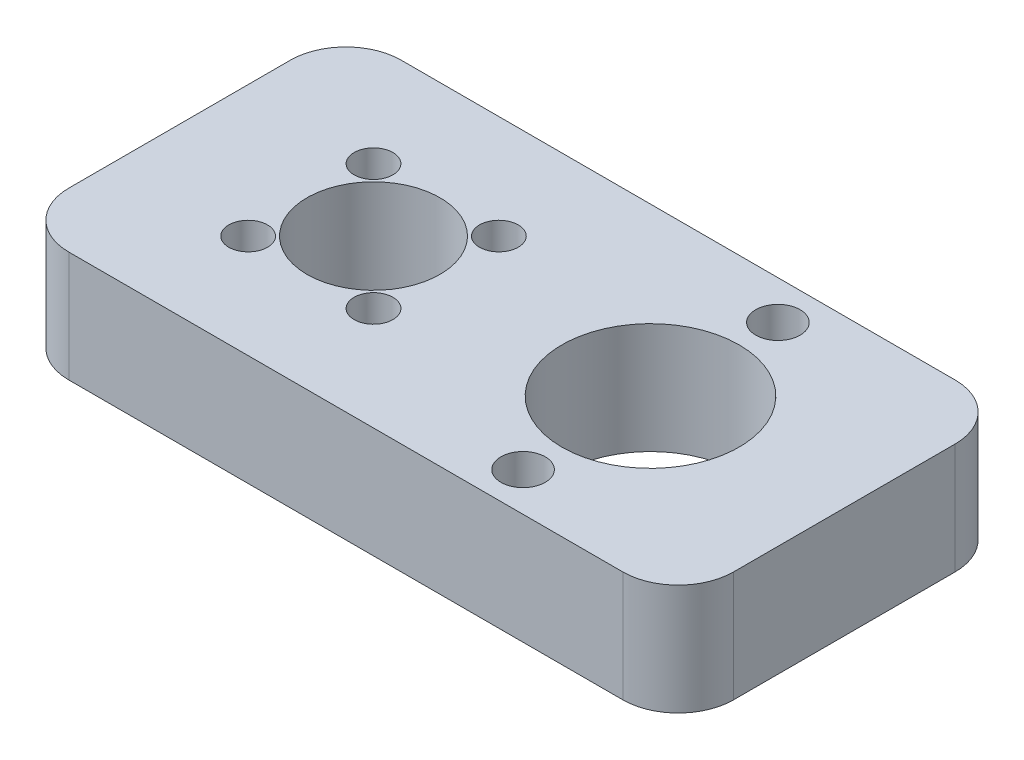
ISO-10303-21;
HEADER;
FILE_DESCRIPTION(('STEP AP214'),'2;1');
FILE_NAME('part.step','',(''),(''),'','','');
FILE_SCHEMA(('AUTOMOTIVE_DESIGN { 1 0 10303 214 1 1 1 1 }'));
ENDSEC;
DATA;
#1=APPLICATION_CONTEXT('core data for automotive mechanical design processes');
#2=APPLICATION_PROTOCOL_DEFINITION('international standard','automotive_design',2000,#1);
#3=PRODUCT_CONTEXT('',#1,'mechanical');
#4=PRODUCT('Part','Part','',(#3));
#5=PRODUCT_RELATED_PRODUCT_CATEGORY('part','',(#4));
#6=PRODUCT_DEFINITION_FORMATION('','',#4);
#7=PRODUCT_DEFINITION_CONTEXT('part definition',#1,'design');
#8=PRODUCT_DEFINITION('design','',#6,#7);
#9=PRODUCT_DEFINITION_SHAPE('','',#8);
#10=(LENGTH_UNIT() NAMED_UNIT(*) SI_UNIT(.MILLI.,.METRE.));
#11=(NAMED_UNIT(*) PLANE_ANGLE_UNIT() SI_UNIT($,.RADIAN.));
#12=(NAMED_UNIT(*) SI_UNIT($,.STERADIAN.) SOLID_ANGLE_UNIT());
#13=UNCERTAINTY_MEASURE_WITH_UNIT(LENGTH_MEASURE(1.E-05),#10,'distance_accuracy_value','');
#14=(GEOMETRIC_REPRESENTATION_CONTEXT(3) GLOBAL_UNCERTAINTY_ASSIGNED_CONTEXT((#13)) GLOBAL_UNIT_ASSIGNED_CONTEXT((#10,
#11,#12)) REPRESENTATION_CONTEXT('',''));
#15=CARTESIAN_POINT('',(0.,0.,0.));
#16=DIRECTION('',(0.,0.,1.));
#17=DIRECTION('',(1.,0.,0.));
#18=AXIS2_PLACEMENT_3D('',#15,#16,#17);
#19=CARTESIAN_POINT('',(0.,10.,0.));
#20=DIRECTION('',(0.,1.,0.));
#21=DIRECTION('',(0.,0.,1.));
#22=AXIS2_PLACEMENT_3D('',#19,#20,#21);
#23=PLANE('',#22);
#24=CARTESIAN_POINT('',(-18.1568542494924,10.,5.65685424949241));
#25=DIRECTION('',(0.,1.,0.));
#26=DIRECTION('',(0.,0.,1.));
#27=AXIS2_PLACEMENT_3D('',#24,#25,#26);
#28=CIRCLE('',#27,1.75);
#29=CARTESIAN_POINT('',(-18.1568542494924,10.,7.40685424949241));
#30=VERTEX_POINT('',#29);
#31=EDGE_CURVE('E253',#30,#30,#28,.T.);
#32=ORIENTED_EDGE('',*,*,#31,.F.);
#33=EDGE_LOOP('',(#32));
#34=FACE_BOUND('',#33,.T.);
#35=CARTESIAN_POINT('',(12.5,10.,0.));
#36=DIRECTION('',(0.,1.,0.));
#37=DIRECTION('',(0.,0.,1.));
#38=AXIS2_PLACEMENT_3D('',#35,#36,#37);
#39=CIRCLE('',#38,8.);
#40=CARTESIAN_POINT('',(12.5,10.,8.));
#41=VERTEX_POINT('',#40);
#42=EDGE_CURVE('E237',#41,#41,#39,.T.);
#43=ORIENTED_EDGE('',*,*,#42,.F.);
#44=EDGE_LOOP('',(#43));
#45=FACE_BOUND('',#44,.T.);
#46=CARTESIAN_POINT('',(-18.1568542494924,10.,-5.65685424949235));
#47=DIRECTION('',(0.,1.,0.));
#48=DIRECTION('',(0.,0.,1.));
#49=AXIS2_PLACEMENT_3D('',#46,#47,#48);
#50=CIRCLE('',#49,1.75);
#51=CARTESIAN_POINT('',(-18.1568542494924,10.,-3.90685424949235));
#52=VERTEX_POINT('',#51);
#53=EDGE_CURVE('E221',#52,#52,#50,.T.);
#54=ORIENTED_EDGE('',*,*,#53,.F.);
#55=EDGE_LOOP('',(#54));
#56=FACE_BOUND('',#55,.T.);
#57=CARTESIAN_POINT('',(12.5,10.,11.5));
#58=DIRECTION('',(0.,1.,0.));
#59=DIRECTION('',(0.,0.,1.));
#60=AXIS2_PLACEMENT_3D('',#57,#58,#59);
#61=CIRCLE('',#60,2.);
#62=CARTESIAN_POINT('',(12.5,10.,13.5));
#63=VERTEX_POINT('',#62);
#64=EDGE_CURVE('E139',#63,#63,#61,.T.);
#65=ORIENTED_EDGE('',*,*,#64,.F.);
#66=EDGE_LOOP('',(#65));
#67=FACE_BOUND('',#66,.T.);
#68=DIRECTION('',(1.,0.,0.));
#69=VECTOR('',#68,1.);
#70=CARTESIAN_POINT('',(-30.,10.,15.));
#71=LINE('',#70,#69);
#72=CARTESIAN_POINT('',(-25.,10.,15.));
#73=VERTEX_POINT('',#72);
#74=CARTESIAN_POINT('',(25.,10.,15.));
#75=VERTEX_POINT('',#74);
#76=EDGE_CURVE('E150',#73,#75,#71,.T.);
#77=ORIENTED_EDGE('',*,*,#76,.T.);
#78=CARTESIAN_POINT('',(25.,10.,10.));
#79=DIRECTION('',(0.,1.,0.));
#80=DIRECTION('',(0.,0.,1.));
#81=AXIS2_PLACEMENT_3D('',#78,#79,#80);
#82=CIRCLE('',#81,5.);
#83=CARTESIAN_POINT('',(30.,10.,9.99999999999999));
#84=VERTEX_POINT('',#83);
#85=EDGE_CURVE('E180',#75,#84,#82,.T.);
#86=ORIENTED_EDGE('',*,*,#85,.T.);
#87=DIRECTION('',(0.,0.,-1.));
#88=VECTOR('',#87,1.);
#89=CARTESIAN_POINT('',(30.,10.,-15.));
#90=LINE('',#89,#88);
#91=CARTESIAN_POINT('',(30.,10.,-10.));
#92=VERTEX_POINT('',#91);
#93=EDGE_CURVE('E129',#84,#92,#90,.T.);
#94=ORIENTED_EDGE('',*,*,#93,.T.);
#95=CARTESIAN_POINT('',(25.,10.,-9.99999999999999));
#96=DIRECTION('',(0.,1.,0.));
#97=DIRECTION('',(0.,0.,1.));
#98=AXIS2_PLACEMENT_3D('',#95,#96,#97);
#99=CIRCLE('',#98,5.);
#100=CARTESIAN_POINT('',(25.,10.,-15.));
#101=VERTEX_POINT('',#100);
#102=EDGE_CURVE('E172',#92,#101,#99,.T.);
#103=ORIENTED_EDGE('',*,*,#102,.T.);
#104=DIRECTION('',(-1.,0.,0.));
#105=VECTOR('',#104,1.);
#106=CARTESIAN_POINT('',(-30.,10.,-15.));
#107=LINE('',#106,#105);
#108=CARTESIAN_POINT('',(-25.,10.,-15.));
#109=VERTEX_POINT('',#108);
#110=EDGE_CURVE('E195',#101,#109,#107,.T.);
#111=ORIENTED_EDGE('',*,*,#110,.T.);
#112=CARTESIAN_POINT('',(-25.,10.,-10.));
#113=DIRECTION('',(0.,1.,0.));
#114=DIRECTION('',(0.,0.,1.));
#115=AXIS2_PLACEMENT_3D('',#112,#113,#114);
#116=CIRCLE('',#115,5.);
#117=CARTESIAN_POINT('',(-30.,10.,-10.));
#118=VERTEX_POINT('',#117);
#119=EDGE_CURVE('E64',#109,#118,#116,.T.);
#120=ORIENTED_EDGE('',*,*,#119,.T.);
#121=DIRECTION('',(0.,0.,1.));
#122=VECTOR('',#121,1.);
#123=CARTESIAN_POINT('',(-30.,10.,-15.));
#124=LINE('',#123,#122);
#125=CARTESIAN_POINT('',(-30.,10.,10.));
#126=VERTEX_POINT('',#125);
#127=EDGE_CURVE('E203',#118,#126,#124,.T.);
#128=ORIENTED_EDGE('',*,*,#127,.T.);
#129=CARTESIAN_POINT('',(-25.,10.,10.));
#130=DIRECTION('',(0.,1.,0.));
#131=DIRECTION('',(0.,0.,1.));
#132=AXIS2_PLACEMENT_3D('',#129,#130,#131);
#133=CIRCLE('',#132,5.);
#134=EDGE_CURVE('E177',#126,#73,#133,.T.);
#135=ORIENTED_EDGE('',*,*,#134,.T.);
#136=EDGE_LOOP('',(#77,#86,#94,#103,#111,#120,#128,#135));
#137=FACE_BOUND('',#136,.T.);
#138=CARTESIAN_POINT('',(-12.5,10.,0.));
#139=DIRECTION('',(0.,1.,0.));
#140=DIRECTION('',(0.,0.,1.));
#141=AXIS2_PLACEMENT_3D('',#138,#139,#140);
#142=CIRCLE('',#141,6.);
#143=CARTESIAN_POINT('',(-12.5,10.,6.));
#144=VERTEX_POINT('',#143);
#145=EDGE_CURVE('E215',#144,#144,#142,.T.);
#146=ORIENTED_EDGE('',*,*,#145,.F.);
#147=EDGE_LOOP('',(#146));
#148=FACE_BOUND('',#147,.T.);
#149=CARTESIAN_POINT('',(-6.84314575050765,10.,-5.65685424949241));
#150=DIRECTION('',(0.,1.,0.));
#151=DIRECTION('',(0.,0.,1.));
#152=AXIS2_PLACEMENT_3D('',#149,#150,#151);
#153=CIRCLE('',#152,1.75);
#154=CARTESIAN_POINT('',(-6.84314575050765,10.,-3.90685424949241));
#155=VERTEX_POINT('',#154);
#156=EDGE_CURVE('E229',#155,#155,#153,.T.);
#157=ORIENTED_EDGE('',*,*,#156,.F.);
#158=EDGE_LOOP('',(#157));
#159=FACE_BOUND('',#158,.T.);
#160=CARTESIAN_POINT('',(-6.84314575050759,10.,5.65685424949235));
#161=DIRECTION('',(0.,1.,0.));
#162=DIRECTION('',(0.,0.,1.));
#163=AXIS2_PLACEMENT_3D('',#160,#161,#162);
#164=CIRCLE('',#163,1.75);
#165=CARTESIAN_POINT('',(-6.84314575050759,10.,7.40685424949235));
#166=VERTEX_POINT('',#165);
#167=EDGE_CURVE('E245',#166,#166,#164,.T.);
#168=ORIENTED_EDGE('',*,*,#167,.F.);
#169=EDGE_LOOP('',(#168));
#170=FACE_BOUND('',#169,.T.);
#171=CARTESIAN_POINT('',(12.5,10.,-11.5));
#172=DIRECTION('',(0.,1.,0.));
#173=DIRECTION('',(0.,0.,1.));
#174=AXIS2_PLACEMENT_3D('',#171,#172,#173);
#175=CIRCLE('',#174,2.);
#176=CARTESIAN_POINT('',(12.5,10.,-9.5));
#177=VERTEX_POINT('',#176);
#178=EDGE_CURVE('E261',#177,#177,#175,.T.);
#179=ORIENTED_EDGE('',*,*,#178,.F.);
#180=EDGE_LOOP('',(#179));
#181=FACE_BOUND('',#180,.T.);
#182=ADVANCED_FACE('F41',(#34,#45,#56,#67,#137,#148,#159,#170,#181),#23,.T.);
#183=CARTESIAN_POINT('',(0.,0.,0.));
#184=DIRECTION('',(0.,1.,0.));
#185=DIRECTION('',(0.,0.,1.));
#186=AXIS2_PLACEMENT_3D('',#183,#184,#185);
#187=PLANE('',#186);
#188=DIRECTION('',(0.,0.,-1.));
#189=VECTOR('',#188,1.);
#190=CARTESIAN_POINT('',(30.,0.,-15.));
#191=LINE('',#190,#189);
#192=CARTESIAN_POINT('',(30.,0.,9.99999999999999));
#193=VERTEX_POINT('',#192);
#194=CARTESIAN_POINT('',(30.,0.,-10.));
#195=VERTEX_POINT('',#194);
#196=EDGE_CURVE('E126',#193,#195,#191,.T.);
#197=ORIENTED_EDGE('',*,*,#196,.F.);
#198=CARTESIAN_POINT('',(25.,0.,10.));
#199=DIRECTION('',(0.,1.,0.));
#200=DIRECTION('',(0.,0.,1.));
#201=AXIS2_PLACEMENT_3D('',#198,#199,#200);
#202=CIRCLE('',#201,5.);
#203=CARTESIAN_POINT('',(25.,0.,15.));
#204=VERTEX_POINT('',#203);
#205=EDGE_CURVE('E108',#193,#204,#202,.F.);
#206=ORIENTED_EDGE('',*,*,#205,.T.);
#207=DIRECTION('',(1.,0.,0.));
#208=VECTOR('',#207,1.);
#209=CARTESIAN_POINT('',(-30.,0.,15.));
#210=LINE('',#209,#208);
#211=CARTESIAN_POINT('',(-25.,0.,15.));
#212=VERTEX_POINT('',#211);
#213=EDGE_CURVE('E155',#212,#204,#210,.T.);
#214=ORIENTED_EDGE('',*,*,#213,.F.);
#215=CARTESIAN_POINT('',(-25.,0.,10.));
#216=DIRECTION('',(0.,1.,0.));
#217=DIRECTION('',(0.,0.,1.));
#218=AXIS2_PLACEMENT_3D('',#215,#216,#217);
#219=CIRCLE('',#218,5.);
#220=CARTESIAN_POINT('',(-30.,0.,10.));
#221=VERTEX_POINT('',#220);
#222=EDGE_CURVE('E120',#212,#221,#219,.F.);
#223=ORIENTED_EDGE('',*,*,#222,.T.);
#224=DIRECTION('',(0.,0.,1.));
#225=VECTOR('',#224,1.);
#226=CARTESIAN_POINT('',(-30.,0.,-15.));
#227=LINE('',#226,#225);
#228=CARTESIAN_POINT('',(-30.,0.,-10.));
#229=VERTEX_POINT('',#228);
#230=EDGE_CURVE('E144',#229,#221,#227,.T.);
#231=ORIENTED_EDGE('',*,*,#230,.F.);
#232=CARTESIAN_POINT('',(-25.,0.,-10.));
#233=DIRECTION('',(0.,1.,0.));
#234=DIRECTION('',(0.,0.,1.));
#235=AXIS2_PLACEMENT_3D('',#232,#233,#234);
#236=CIRCLE('',#235,5.);
#237=CARTESIAN_POINT('',(-25.,0.,-15.));
#238=VERTEX_POINT('',#237);
#239=EDGE_CURVE('E162',#229,#238,#236,.F.);
#240=ORIENTED_EDGE('',*,*,#239,.T.);
#241=DIRECTION('',(-1.,0.,0.));
#242=VECTOR('',#241,1.);
#243=CARTESIAN_POINT('',(-30.,0.,-15.));
#244=LINE('',#243,#242);
#245=CARTESIAN_POINT('',(25.,0.,-15.));
#246=VERTEX_POINT('',#245);
#247=EDGE_CURVE('E138',#246,#238,#244,.T.);
#248=ORIENTED_EDGE('',*,*,#247,.F.);
#249=CARTESIAN_POINT('',(25.,0.,-9.99999999999999));
#250=DIRECTION('',(0.,1.,0.));
#251=DIRECTION('',(0.,0.,1.));
#252=AXIS2_PLACEMENT_3D('',#249,#250,#251);
#253=CIRCLE('',#252,5.);
#254=EDGE_CURVE('E131',#246,#195,#253,.F.);
#255=ORIENTED_EDGE('',*,*,#254,.T.);
#256=EDGE_LOOP('',(#197,#206,#214,#223,#231,#240,#248,#255));
#257=FACE_BOUND('',#256,.T.);
#258=CARTESIAN_POINT('',(12.5,0.,11.5));
#259=DIRECTION('',(0.,1.,0.));
#260=DIRECTION('',(0.,0.,1.));
#261=AXIS2_PLACEMENT_3D('',#258,#259,#260);
#262=CIRCLE('',#261,2.);
#263=CARTESIAN_POINT('',(12.5,0.,13.5));
#264=VERTEX_POINT('',#263);
#265=EDGE_CURVE('E147',#264,#264,#262,.T.);
#266=ORIENTED_EDGE('',*,*,#265,.T.);
#267=EDGE_LOOP('',(#266));
#268=FACE_BOUND('',#267,.T.);
#269=CARTESIAN_POINT('',(-12.5,0.,0.));
#270=DIRECTION('',(0.,1.,0.));
#271=DIRECTION('',(0.,0.,1.));
#272=AXIS2_PLACEMENT_3D('',#269,#270,#271);
#273=CIRCLE('',#272,6.);
#274=CARTESIAN_POINT('',(-12.5,0.,6.));
#275=VERTEX_POINT('',#274);
#276=EDGE_CURVE('E217',#275,#275,#273,.T.);
#277=ORIENTED_EDGE('',*,*,#276,.T.);
#278=EDGE_LOOP('',(#277));
#279=FACE_BOUND('',#278,.T.);
#280=CARTESIAN_POINT('',(-18.1568542494924,0.,-5.65685424949235));
#281=DIRECTION('',(0.,1.,0.));
#282=DIRECTION('',(0.,0.,1.));
#283=AXIS2_PLACEMENT_3D('',#280,#281,#282);
#284=CIRCLE('',#283,1.75);
#285=CARTESIAN_POINT('',(-18.1568542494924,0.,-3.90685424949235));
#286=VERTEX_POINT('',#285);
#287=EDGE_CURVE('E225',#286,#286,#284,.T.);
#288=ORIENTED_EDGE('',*,*,#287,.T.);
#289=EDGE_LOOP('',(#288));
#290=FACE_BOUND('',#289,.T.);
#291=CARTESIAN_POINT('',(-6.84314575050765,0.,-5.65685424949241));
#292=DIRECTION('',(0.,1.,0.));
#293=DIRECTION('',(0.,0.,1.));
#294=AXIS2_PLACEMENT_3D('',#291,#292,#293);
#295=CIRCLE('',#294,1.75);
#296=CARTESIAN_POINT('',(-6.84314575050765,0.,-3.90685424949241));
#297=VERTEX_POINT('',#296);
#298=EDGE_CURVE('E233',#297,#297,#295,.T.);
#299=ORIENTED_EDGE('',*,*,#298,.T.);
#300=EDGE_LOOP('',(#299));
#301=FACE_BOUND('',#300,.T.);
#302=CARTESIAN_POINT('',(12.5,0.,0.));
#303=DIRECTION('',(0.,1.,0.));
#304=DIRECTION('',(0.,0.,1.));
#305=AXIS2_PLACEMENT_3D('',#302,#303,#304);
#306=CIRCLE('',#305,8.);
#307=CARTESIAN_POINT('',(12.5,0.,8.));
#308=VERTEX_POINT('',#307);
#309=EDGE_CURVE('E241',#308,#308,#306,.T.);
#310=ORIENTED_EDGE('',*,*,#309,.T.);
#311=EDGE_LOOP('',(#310));
#312=FACE_BOUND('',#311,.T.);
#313=CARTESIAN_POINT('',(-6.84314575050759,0.,5.65685424949235));
#314=DIRECTION('',(0.,1.,0.));
#315=DIRECTION('',(0.,0.,1.));
#316=AXIS2_PLACEMENT_3D('',#313,#314,#315);
#317=CIRCLE('',#316,1.75);
#318=CARTESIAN_POINT('',(-6.84314575050759,0.,7.40685424949235));
#319=VERTEX_POINT('',#318);
#320=EDGE_CURVE('E249',#319,#319,#317,.T.);
#321=ORIENTED_EDGE('',*,*,#320,.T.);
#322=EDGE_LOOP('',(#321));
#323=FACE_BOUND('',#322,.T.);
#324=CARTESIAN_POINT('',(-18.1568542494924,0.,5.65685424949241));
#325=DIRECTION('',(0.,1.,0.));
#326=DIRECTION('',(0.,0.,1.));
#327=AXIS2_PLACEMENT_3D('',#324,#325,#326);
#328=CIRCLE('',#327,1.75);
#329=CARTESIAN_POINT('',(-18.1568542494924,0.,7.40685424949241));
#330=VERTEX_POINT('',#329);
#331=EDGE_CURVE('E257',#330,#330,#328,.T.);
#332=ORIENTED_EDGE('',*,*,#331,.T.);
#333=EDGE_LOOP('',(#332));
#334=FACE_BOUND('',#333,.T.);
#335=CARTESIAN_POINT('',(12.5,0.,-11.5));
#336=DIRECTION('',(0.,1.,0.));
#337=DIRECTION('',(0.,0.,1.));
#338=AXIS2_PLACEMENT_3D('',#335,#336,#337);
#339=CIRCLE('',#338,2.);
#340=CARTESIAN_POINT('',(12.5,0.,-9.5));
#341=VERTEX_POINT('',#340);
#342=EDGE_CURVE('E265',#341,#341,#339,.T.);
#343=ORIENTED_EDGE('',*,*,#342,.T.);
#344=EDGE_LOOP('',(#343));
#345=FACE_BOUND('',#344,.T.);
#346=ADVANCED_FACE('F134',(#257,#268,#279,#290,#301,#312,#323,#334,#345),#187,.F.);
#347=CARTESIAN_POINT('',(30.,10.,-15.));
#348=DIRECTION('',(-1.,0.,0.));
#349=DIRECTION('',(0.,0.,1.));
#350=AXIS2_PLACEMENT_3D('',#347,#348,#349);
#351=PLANE('',#350);
#352=ORIENTED_EDGE('',*,*,#93,.F.);
#353=DIRECTION('',(0.,-1.,0.));
#354=VECTOR('',#353,1.);
#355=CARTESIAN_POINT('',(30.,10.,10.));
#356=LINE('',#355,#354);
#357=EDGE_CURVE('E112',#84,#193,#356,.T.);
#358=ORIENTED_EDGE('',*,*,#357,.T.);
#359=ORIENTED_EDGE('',*,*,#196,.T.);
#360=DIRECTION('',(0.,-1.,0.));
#361=VECTOR('',#360,1.);
#362=CARTESIAN_POINT('',(30.,10.,-10.));
#363=LINE('',#362,#361);
#364=EDGE_CURVE('E132',#195,#92,#363,.F.);
#365=ORIENTED_EDGE('',*,*,#364,.T.);
#366=EDGE_LOOP('',(#352,#358,#359,#365));
#367=FACE_BOUND('',#366,.T.);
#368=ADVANCED_FACE('F125',(#367),#351,.F.);
#369=CARTESIAN_POINT('',(-30.,10.,-15.));
#370=DIRECTION('',(0.,0.,1.));
#371=DIRECTION('',(1.,0.,0.));
#372=AXIS2_PLACEMENT_3D('',#369,#370,#371);
#373=PLANE('',#372);
#374=ORIENTED_EDGE('',*,*,#247,.T.);
#375=DIRECTION('',(0.,-1.,0.));
#376=VECTOR('',#375,1.);
#377=CARTESIAN_POINT('',(-25.,10.,-15.));
#378=LINE('',#377,#376);
#379=EDGE_CURVE('E11',#238,#109,#378,.F.);
#380=ORIENTED_EDGE('',*,*,#379,.T.);
#381=ORIENTED_EDGE('',*,*,#110,.F.);
#382=DIRECTION('',(0.,-1.,0.));
#383=VECTOR('',#382,1.);
#384=CARTESIAN_POINT('',(25.,10.,-15.));
#385=LINE('',#384,#383);
#386=EDGE_CURVE('E50',#101,#246,#385,.T.);
#387=ORIENTED_EDGE('',*,*,#386,.T.);
#388=EDGE_LOOP('',(#374,#380,#381,#387));
#389=FACE_BOUND('',#388,.T.);
#390=ADVANCED_FACE('F193',(#389),#373,.F.);
#391=CARTESIAN_POINT('',(-30.,10.,-15.));
#392=DIRECTION('',(1.,0.,0.));
#393=DIRECTION('',(0.,0.,-1.));
#394=AXIS2_PLACEMENT_3D('',#391,#392,#393);
#395=PLANE('',#394);
#396=ORIENTED_EDGE('',*,*,#230,.T.);
#397=DIRECTION('',(0.,-1.,0.));
#398=VECTOR('',#397,1.);
#399=CARTESIAN_POINT('',(-30.,10.,10.));
#400=LINE('',#399,#398);
#401=EDGE_CURVE('E57',#221,#126,#400,.F.);
#402=ORIENTED_EDGE('',*,*,#401,.T.);
#403=ORIENTED_EDGE('',*,*,#127,.F.);
#404=DIRECTION('',(0.,-1.,0.));
#405=VECTOR('',#404,1.);
#406=CARTESIAN_POINT('',(-30.,10.,-10.));
#407=LINE('',#406,#405);
#408=EDGE_CURVE('E183',#118,#229,#407,.T.);
#409=ORIENTED_EDGE('',*,*,#408,.T.);
#410=EDGE_LOOP('',(#396,#402,#403,#409));
#411=FACE_BOUND('',#410,.T.);
#412=ADVANCED_FACE('F202',(#411),#395,.F.);
#413=CARTESIAN_POINT('',(-30.,10.,15.));
#414=DIRECTION('',(0.,0.,-1.));
#415=DIRECTION('',(-1.,0.,0.));
#416=AXIS2_PLACEMENT_3D('',#413,#414,#415);
#417=PLANE('',#416);
#418=ORIENTED_EDGE('',*,*,#213,.T.);
#419=DIRECTION('',(0.,-1.,0.));
#420=VECTOR('',#419,1.);
#421=CARTESIAN_POINT('',(25.,10.,15.));
#422=LINE('',#421,#420);
#423=EDGE_CURVE('E113',#204,#75,#422,.F.);
#424=ORIENTED_EDGE('',*,*,#423,.T.);
#425=ORIENTED_EDGE('',*,*,#76,.F.);
#426=DIRECTION('',(0.,-1.,0.));
#427=VECTOR('',#426,1.);
#428=CARTESIAN_POINT('',(-25.,10.,15.));
#429=LINE('',#428,#427);
#430=EDGE_CURVE('E119',#73,#212,#429,.T.);
#431=ORIENTED_EDGE('',*,*,#430,.T.);
#432=EDGE_LOOP('',(#418,#424,#425,#431));
#433=FACE_BOUND('',#432,.T.);
#434=ADVANCED_FACE('F289',(#433),#417,.F.);
#435=CARTESIAN_POINT('',(12.5,10.,11.5));
#436=DIRECTION('',(0.,-1.,0.));
#437=DIRECTION('',(0.,0.,-1.));
#438=AXIS2_PLACEMENT_3D('',#435,#436,#437);
#439=CYLINDRICAL_SURFACE('',#438,2.);
#440=ORIENTED_EDGE('',*,*,#64,.T.);
#441=EDGE_LOOP('',(#440));
#442=FACE_BOUND('',#441,.T.);
#443=ORIENTED_EDGE('',*,*,#265,.F.);
#444=EDGE_LOOP('',(#443));
#445=FACE_BOUND('',#444,.T.);
#446=ADVANCED_FACE('F286',(#442,#445),#439,.F.);
#447=CARTESIAN_POINT('',(-12.5,10.,0.));
#448=DIRECTION('',(0.,-1.,0.));
#449=DIRECTION('',(0.,0.,-1.));
#450=AXIS2_PLACEMENT_3D('',#447,#448,#449);
#451=CYLINDRICAL_SURFACE('',#450,6.);
#452=ORIENTED_EDGE('',*,*,#145,.T.);
#453=EDGE_LOOP('',(#452));
#454=FACE_BOUND('',#453,.T.);
#455=ORIENTED_EDGE('',*,*,#276,.F.);
#456=EDGE_LOOP('',(#455));
#457=FACE_BOUND('',#456,.T.);
#458=ADVANCED_FACE('F348',(#454,#457),#451,.F.);
#459=CARTESIAN_POINT('',(-18.1568542494924,10.,-5.65685424949235));
#460=DIRECTION('',(0.,-1.,0.));
#461=DIRECTION('',(0.,0.,-1.));
#462=AXIS2_PLACEMENT_3D('',#459,#460,#461);
#463=CYLINDRICAL_SURFACE('',#462,1.75);
#464=ORIENTED_EDGE('',*,*,#53,.T.);
#465=EDGE_LOOP('',(#464));
#466=FACE_BOUND('',#465,.T.);
#467=ORIENTED_EDGE('',*,*,#287,.F.);
#468=EDGE_LOOP('',(#467));
#469=FACE_BOUND('',#468,.T.);
#470=ADVANCED_FACE('F345',(#466,#469),#463,.F.);
#471=CARTESIAN_POINT('',(-6.84314575050765,10.,-5.65685424949241));
#472=DIRECTION('',(0.,-1.,0.));
#473=DIRECTION('',(0.,0.,-1.));
#474=AXIS2_PLACEMENT_3D('',#471,#472,#473);
#475=CYLINDRICAL_SURFACE('',#474,1.75);
#476=ORIENTED_EDGE('',*,*,#156,.T.);
#477=EDGE_LOOP('',(#476));
#478=FACE_BOUND('',#477,.T.);
#479=ORIENTED_EDGE('',*,*,#298,.F.);
#480=EDGE_LOOP('',(#479));
#481=FACE_BOUND('',#480,.T.);
#482=ADVANCED_FACE('F341',(#478,#481),#475,.F.);
#483=CARTESIAN_POINT('',(12.5,10.,0.));
#484=DIRECTION('',(0.,-1.,0.));
#485=DIRECTION('',(0.,0.,-1.));
#486=AXIS2_PLACEMENT_3D('',#483,#484,#485);
#487=CYLINDRICAL_SURFACE('',#486,8.);
#488=ORIENTED_EDGE('',*,*,#42,.T.);
#489=EDGE_LOOP('',(#488));
#490=FACE_BOUND('',#489,.T.);
#491=ORIENTED_EDGE('',*,*,#309,.F.);
#492=EDGE_LOOP('',(#491));
#493=FACE_BOUND('',#492,.T.);
#494=ADVANCED_FACE('F323',(#490,#493),#487,.F.);
#495=CARTESIAN_POINT('',(-6.84314575050759,10.,5.65685424949235));
#496=DIRECTION('',(0.,-1.,0.));
#497=DIRECTION('',(0.,0.,-1.));
#498=AXIS2_PLACEMENT_3D('',#495,#496,#497);
#499=CYLINDRICAL_SURFACE('',#498,1.75);
#500=ORIENTED_EDGE('',*,*,#167,.T.);
#501=EDGE_LOOP('',(#500));
#502=FACE_BOUND('',#501,.T.);
#503=ORIENTED_EDGE('',*,*,#320,.F.);
#504=EDGE_LOOP('',(#503));
#505=FACE_BOUND('',#504,.T.);
#506=ADVANCED_FACE('F319',(#502,#505),#499,.F.);
#507=CARTESIAN_POINT('',(-18.1568542494924,10.,5.65685424949241));
#508=DIRECTION('',(0.,-1.,0.));
#509=DIRECTION('',(0.,0.,-1.));
#510=AXIS2_PLACEMENT_3D('',#507,#508,#509);
#511=CYLINDRICAL_SURFACE('',#510,1.75);
#512=ORIENTED_EDGE('',*,*,#31,.T.);
#513=EDGE_LOOP('',(#512));
#514=FACE_BOUND('',#513,.T.);
#515=ORIENTED_EDGE('',*,*,#331,.F.);
#516=EDGE_LOOP('',(#515));
#517=FACE_BOUND('',#516,.T.);
#518=ADVANCED_FACE('F322',(#514,#517),#511,.F.);
#519=CARTESIAN_POINT('',(12.5,10.,-11.5));
#520=DIRECTION('',(0.,-1.,0.));
#521=DIRECTION('',(0.,0.,-1.));
#522=AXIS2_PLACEMENT_3D('',#519,#520,#521);
#523=CYLINDRICAL_SURFACE('',#522,2.);
#524=ORIENTED_EDGE('',*,*,#178,.T.);
#525=EDGE_LOOP('',(#524));
#526=FACE_BOUND('',#525,.T.);
#527=ORIENTED_EDGE('',*,*,#342,.F.);
#528=EDGE_LOOP('',(#527));
#529=FACE_BOUND('',#528,.T.);
#530=ADVANCED_FACE('F273',(#526,#529),#523,.F.);
#531=CARTESIAN_POINT('',(25.,10.,10.));
#532=DIRECTION('',(0.,-1.,0.));
#533=DIRECTION('',(0.,0.,-1.));
#534=AXIS2_PLACEMENT_3D('',#531,#532,#533);
#535=CYLINDRICAL_SURFACE('',#534,5.);
#536=ORIENTED_EDGE('',*,*,#85,.F.);
#537=ORIENTED_EDGE('',*,*,#423,.F.);
#538=ORIENTED_EDGE('',*,*,#205,.F.);
#539=ORIENTED_EDGE('',*,*,#357,.F.);
#540=EDGE_LOOP('',(#536,#537,#538,#539));
#541=FACE_BOUND('',#540,.T.);
#542=ADVANCED_FACE('F111',(#541),#535,.T.);
#543=CARTESIAN_POINT('',(-25.,10.,10.));
#544=DIRECTION('',(0.,-1.,0.));
#545=DIRECTION('',(0.,0.,-1.));
#546=AXIS2_PLACEMENT_3D('',#543,#544,#545);
#547=CYLINDRICAL_SURFACE('',#546,5.);
#548=ORIENTED_EDGE('',*,*,#134,.F.);
#549=ORIENTED_EDGE('',*,*,#401,.F.);
#550=ORIENTED_EDGE('',*,*,#222,.F.);
#551=ORIENTED_EDGE('',*,*,#430,.F.);
#552=EDGE_LOOP('',(#548,#549,#550,#551));
#553=FACE_BOUND('',#552,.T.);
#554=ADVANCED_FACE('F301',(#553),#547,.T.);
#555=CARTESIAN_POINT('',(-25.,10.,-10.));
#556=DIRECTION('',(0.,-1.,0.));
#557=DIRECTION('',(0.,0.,-1.));
#558=AXIS2_PLACEMENT_3D('',#555,#556,#557);
#559=CYLINDRICAL_SURFACE('',#558,5.);
#560=ORIENTED_EDGE('',*,*,#119,.F.);
#561=ORIENTED_EDGE('',*,*,#379,.F.);
#562=ORIENTED_EDGE('',*,*,#239,.F.);
#563=ORIENTED_EDGE('',*,*,#408,.F.);
#564=EDGE_LOOP('',(#560,#561,#562,#563));
#565=FACE_BOUND('',#564,.T.);
#566=ADVANCED_FACE('F201',(#565),#559,.T.);
#567=CARTESIAN_POINT('',(25.,10.,-9.99999999999999));
#568=DIRECTION('',(0.,-1.,0.));
#569=DIRECTION('',(0.,0.,-1.));
#570=AXIS2_PLACEMENT_3D('',#567,#568,#569);
#571=CYLINDRICAL_SURFACE('',#570,5.);
#572=ORIENTED_EDGE('',*,*,#102,.F.);
#573=ORIENTED_EDGE('',*,*,#364,.F.);
#574=ORIENTED_EDGE('',*,*,#254,.F.);
#575=ORIENTED_EDGE('',*,*,#386,.F.);
#576=EDGE_LOOP('',(#572,#573,#574,#575));
#577=FACE_BOUND('',#576,.T.);
#578=ADVANCED_FACE('F43',(#577),#571,.T.);
#579=CLOSED_SHELL('',(#182,#346,#368,#390,#412,#434,#446,#458,#470,#482,#494,#506,#518,#530,
#542,#554,#566,#578));
#580=MANIFOLD_SOLID_BREP('B2',#579);
#581=ADVANCED_BREP_SHAPE_REPRESENTATION('',(#18,#580),#14);
#582=SHAPE_DEFINITION_REPRESENTATION(#9,#581);
ENDSEC;
END-ISO-10303-21;
